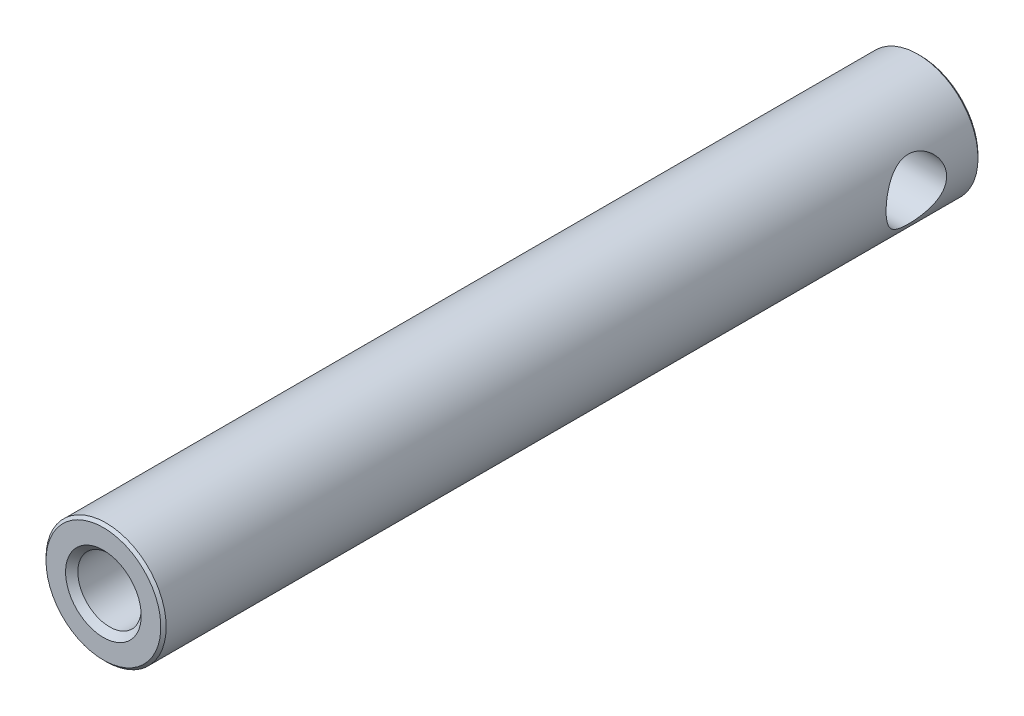
ISO-10303-21;
HEADER;
FILE_DESCRIPTION(('STEP AP214'),'2;1');
FILE_NAME('part.step','',(''),(''),'','','');
FILE_SCHEMA(('AUTOMOTIVE_DESIGN { 1 0 10303 214 1 1 1 1 }'));
ENDSEC;
DATA;
#1=APPLICATION_CONTEXT('core data for automotive mechanical design processes');
#2=APPLICATION_PROTOCOL_DEFINITION('international standard','automotive_design',2000,#1);
#3=PRODUCT_CONTEXT('',#1,'mechanical');
#4=PRODUCT('Part','Part','',(#3));
#5=PRODUCT_RELATED_PRODUCT_CATEGORY('part','',(#4));
#6=PRODUCT_DEFINITION_FORMATION('','',#4);
#7=PRODUCT_DEFINITION_CONTEXT('part definition',#1,'design');
#8=PRODUCT_DEFINITION('design','',#6,#7);
#9=PRODUCT_DEFINITION_SHAPE('','',#8);
#10=(LENGTH_UNIT() NAMED_UNIT(*) SI_UNIT(.MILLI.,.METRE.));
#11=(NAMED_UNIT(*) PLANE_ANGLE_UNIT() SI_UNIT($,.RADIAN.));
#12=(NAMED_UNIT(*) SI_UNIT($,.STERADIAN.) SOLID_ANGLE_UNIT());
#13=UNCERTAINTY_MEASURE_WITH_UNIT(LENGTH_MEASURE(1.E-05),#10,'distance_accuracy_value','');
#14=(GEOMETRIC_REPRESENTATION_CONTEXT(3) GLOBAL_UNCERTAINTY_ASSIGNED_CONTEXT((#13)) GLOBAL_UNIT_ASSIGNED_CONTEXT((#10,
#11,#12)) REPRESENTATION_CONTEXT('',''));
#15=CARTESIAN_POINT('',(0.,0.,0.));
#16=DIRECTION('',(0.,0.,1.));
#17=DIRECTION('',(1.,0.,0.));
#18=AXIS2_PLACEMENT_3D('',#15,#16,#17);
#19=CARTESIAN_POINT('',(0.,0.,62.5858800000856));
#20=DIRECTION('',(0.,0.,1.));
#21=DIRECTION('',(1.,0.,0.));
#22=AXIS2_PLACEMENT_3D('',#19,#20,#21);
#23=CONICAL_SURFACE('',#22,4.18800000011288,1.09918075892234);
#24=CARTESIAN_POINT('',(0.,0.,62.58588));
#25=DIRECTION('',(0.,0.,1.));
#26=DIRECTION('',(0.,-1.,0.));
#27=AXIS2_PLACEMENT_3D('',#24,#25,#26);
#28=CIRCLE('',#27,4.188);
#29=CARTESIAN_POINT('',(0.,-4.188,62.58588));
#30=VERTEX_POINT('',#29);
#31=EDGE_CURVE('E83',#30,#30,#28,.T.);
#32=ORIENTED_EDGE('',*,*,#31,.T.);
#33=EDGE_LOOP('',(#32));
#34=FACE_BOUND('',#33,.T.);
#35=CARTESIAN_POINT('',(0.,5.6843418860808E-11,60.4500000000314));
#36=VERTEX_POINT('',#35);
#37=VERTEX_LOOP('',#36);
#38=FACE_BOUND('',#37,.T.);
#39=ADVANCED_FACE('F17',(#34,#38),#23,.F.);
#40=CARTESIAN_POINT('',(0.,0.,60.45));
#41=DIRECTION('',(0.,0.,1.));
#42=DIRECTION('',(0.,-1.,0.));
#43=AXIS2_PLACEMENT_3D('',#40,#41,#42);
#44=CYLINDRICAL_SURFACE('',#43,4.188);
#45=ORIENTED_EDGE('',*,*,#31,.F.);
#46=EDGE_LOOP('',(#45));
#47=FACE_BOUND('',#46,.T.);
#48=CARTESIAN_POINT('',(0.,0.,98.6880000000383));
#49=DIRECTION('',(0.,0.,1.));
#50=DIRECTION('',(0.,-1.,0.));
#51=AXIS2_PLACEMENT_3D('',#48,#49,#50);
#52=CIRCLE('',#51,4.18799999994236);
#53=CARTESIAN_POINT('',(0.,-4.18799999994235,98.6880000000383));
#54=VERTEX_POINT('',#53);
#55=EDGE_CURVE('E78',#54,#54,#52,.T.);
#56=ORIENTED_EDGE('',*,*,#55,.T.);
#57=EDGE_LOOP('',(#56));
#58=FACE_BOUND('',#57,.T.);
#59=ADVANCED_FACE('F30',(#47,#58),#44,.F.);
#60=CARTESIAN_POINT('',(0.,0.,99.4999999999777));
#61=DIRECTION('',(0.,0.,1.));
#62=DIRECTION('',(1.,0.,0.));
#63=AXIS2_PLACEMENT_3D('',#60,#61,#62);
#64=CONICAL_SURFACE('',#63,4.99999999988177,0.785398163397448);
#65=CARTESIAN_POINT('',(0.,0.,99.5000000000346));
#66=DIRECTION('',(0.,0.,1.));
#67=DIRECTION('',(1.,0.,0.));
#68=AXIS2_PLACEMENT_3D('',#65,#66,#67);
#69=CIRCLE('',#68,4.99999999993862);
#70=CARTESIAN_POINT('',(4.99999999993862,0.,99.5000000000346));
#71=VERTEX_POINT('',#70);
#72=EDGE_CURVE('E20',#71,#71,#69,.T.);
#73=ORIENTED_EDGE('',*,*,#72,.T.);
#74=EDGE_LOOP('',(#73));
#75=FACE_BOUND('',#74,.T.);
#76=ORIENTED_EDGE('',*,*,#55,.F.);
#77=EDGE_LOOP('',(#76));
#78=FACE_BOUND('',#77,.T.);
#79=ADVANCED_FACE('F35',(#75,#78),#64,.F.);
#80=CARTESIAN_POINT('',(0.,0.,99.5));
#81=DIRECTION('',(0.,0.,-1.));
#82=DIRECTION('',(-1.,0.,0.));
#83=AXIS2_PLACEMENT_3D('',#80,#81,#82);
#84=PLANE('',#83);
#85=ORIENTED_EDGE('',*,*,#72,.F.);
#86=EDGE_LOOP('',(#85));
#87=FACE_BOUND('',#86,.T.);
#88=CARTESIAN_POINT('',(0.,0.,99.5000000000346));
#89=DIRECTION('',(0.,0.,-1.));
#90=DIRECTION('',(-1.,0.,0.));
#91=AXIS2_PLACEMENT_3D('',#88,#89,#90);
#92=CIRCLE('',#91,7.58644660936625);
#93=CARTESIAN_POINT('',(-7.58644660936625,0.,99.5000000000346));
#94=VERTEX_POINT('',#93);
#95=EDGE_CURVE('E69',#94,#94,#92,.T.);
#96=ORIENTED_EDGE('',*,*,#95,.F.);
#97=EDGE_LOOP('',(#96));
#98=FACE_BOUND('',#97,.T.);
#99=ADVANCED_FACE('F104',(#87,#98),#84,.F.);
#100=CARTESIAN_POINT('',(0.,7.58644660940673,-8.50000000000001));
#101=DIRECTION('',(0.,0.,1.));
#102=DIRECTION('',(1.,0.,0.));
#103=AXIS2_PLACEMENT_3D('',#100,#101,#102);
#104=PLANE('',#103);
#105=CARTESIAN_POINT('',(0.,0.,-8.50000000002638));
#106=DIRECTION('',(0.,0.,1.));
#107=DIRECTION('',(1.,0.,0.));
#108=AXIS2_PLACEMENT_3D('',#105,#106,#107);
#109=CIRCLE('',#108,7.58644660936625);
#110=CARTESIAN_POINT('',(7.58644660936625,0.,-8.50000000002638));
#111=VERTEX_POINT('',#110);
#112=EDGE_CURVE('E66',#111,#111,#109,.T.);
#113=ORIENTED_EDGE('',*,*,#112,.F.);
#114=EDGE_LOOP('',(#113));
#115=FACE_BOUND('',#114,.T.);
#116=ADVANCED_FACE('F98',(#115),#104,.F.);
#117=CARTESIAN_POINT('',(0.,0.,99.1464466093248));
#118=DIRECTION('',(0.,0.,-1.));
#119=DIRECTION('',(-1.,0.,0.));
#120=AXIS2_PLACEMENT_3D('',#117,#118,#119);
#121=CONICAL_SURFACE('',#120,7.94000000013284,0.785398163477837);
#122=ORIENTED_EDGE('',*,*,#95,.T.);
#123=EDGE_LOOP('',(#122));
#124=FACE_BOUND('',#123,.T.);
#125=CARTESIAN_POINT('',(0.,0.,99.1464466094067));
#126=DIRECTION('',(0.,0.,1.));
#127=DIRECTION('',(1.,0.,0.));
#128=AXIS2_PLACEMENT_3D('',#125,#126,#127);
#129=CIRCLE('',#128,7.94);
#130=CARTESIAN_POINT('',(7.94,0.,99.1464466094067));
#131=VERTEX_POINT('',#130);
#132=EDGE_CURVE('E65',#131,#131,#129,.F.);
#133=ORIENTED_EDGE('',*,*,#132,.F.);
#134=EDGE_LOOP('',(#133));
#135=FACE_BOUND('',#134,.T.);
#136=ADVANCED_FACE('F96',(#124,#135),#121,.T.);
#137=CARTESIAN_POINT('',(0.,0.,-8.14644660948716));
#138=DIRECTION('',(0.,0.,1.));
#139=DIRECTION('',(1.,0.,0.));
#140=AXIS2_PLACEMENT_3D('',#137,#138,#139);
#141=CONICAL_SURFACE('',#140,7.93999999990547,0.785398163397448);
#142=CARTESIAN_POINT('',(0.,0.,-8.14644660940674));
#143=DIRECTION('',(0.,0.,1.));
#144=DIRECTION('',(1.,0.,0.));
#145=AXIS2_PLACEMENT_3D('',#142,#143,#144);
#146=CIRCLE('',#145,7.94);
#147=CARTESIAN_POINT('',(7.94,0.,-8.14644660940674));
#148=VERTEX_POINT('',#147);
#149=EDGE_CURVE('E25',#148,#148,#146,.T.);
#150=ORIENTED_EDGE('',*,*,#149,.F.);
#151=EDGE_LOOP('',(#150));
#152=FACE_BOUND('',#151,.T.);
#153=ORIENTED_EDGE('',*,*,#112,.T.);
#154=EDGE_LOOP('',(#153));
#155=FACE_BOUND('',#154,.T.);
#156=ADVANCED_FACE('F45',(#152,#155),#141,.T.);
#157=CARTESIAN_POINT('',(7.99999999999999,0.,0.));
#158=DIRECTION('',(-1.,0.,0.));
#159=DIRECTION('',(0.,0.,1.));
#160=AXIS2_PLACEMENT_3D('',#157,#158,#159);
#161=CYLINDRICAL_SURFACE('',#160,4.);
#162=CARTESIAN_POINT('',(7.94,0.,4.));
#163=CARTESIAN_POINT('',(7.9400021109714,0.10517109395759,4.00000239787744));
#164=CARTESIAN_POINT('',(7.93790678019679,0.210316836597848,3.99584935438447));
#165=CARTESIAN_POINT('',(7.92958587567543,0.419823475354952,3.97929473117448));
#166=CARTESIAN_POINT('',(7.9233594753153,0.524184210166777,3.96689150062098));
#167=CARTESIAN_POINT('',(7.90692758591714,0.73136809049458,3.93396847953211));
#168=CARTESIAN_POINT('',(7.8967195406061,0.834190204069325,3.91344347457849));
#169=CARTESIAN_POINT('',(7.87259012597145,1.03751294018156,3.86452074199203));
#170=CARTESIAN_POINT('',(7.85866727708254,1.13801262035099,3.83611987731341));
#171=CARTESIAN_POINT('',(7.8119366165829,1.43420400295598,3.7397802716423));
#172=CARTESIAN_POINT('',(7.77408447370945,1.62556440007457,3.66054625467148));
#173=CARTESIAN_POINT('',(7.68839341943362,1.99191779590018,3.47484599731364));
#174=CARTESIAN_POINT('',(7.64055328871838,2.16690879248435,3.36837643170946));
#175=CARTESIAN_POINT('',(7.5358349439488,2.50767653621529,3.12380363165635));
#176=CARTESIAN_POINT('',(7.47858322455208,2.67223820509634,2.98416577819797));
#177=CARTESIAN_POINT('',(7.36270510461318,2.97670513270393,2.68058834780447));
#178=CARTESIAN_POINT('',(7.30407772577618,3.11659220258305,2.516631006328));
#179=CARTESIAN_POINT('',(7.18670638897149,3.37892137501901,2.15333411015012));
#180=CARTESIAN_POINT('',(7.12831956831329,3.49911032903864,1.95222214894955));
#181=CARTESIAN_POINT('',(7.05035928556317,3.65230423274154,1.63538564166146));
#182=CARTESIAN_POINT('',(7.02596923600123,3.69886509509496,1.52720626159389));
#183=CARTESIAN_POINT('',(6.98131184278196,3.78247681559869,1.30643507869609));
#184=CARTESIAN_POINT('',(6.96104204321276,3.81953334236221,1.19384595235427));
#185=CARTESIAN_POINT('',(6.92653922743123,3.88173219898337,0.971923797884869));
#186=CARTESIAN_POINT('',(6.91201808020868,3.90745368893792,0.862797597732118));
#187=CARTESIAN_POINT('',(6.88797006236582,3.94969129329074,0.642284704688069));
#188=CARTESIAN_POINT('',(6.87844052265092,3.96621232762306,0.530899253021939));
#189=CARTESIAN_POINT('',(6.86478534470937,3.98980066613343,0.306869956275632));
#190=CARTESIAN_POINT('',(6.86065634843621,3.99687384502621,0.19422693714066));
#191=CARTESIAN_POINT('',(6.8579784520976,4.00146718414805,-0.0313135204275492));
#192=CARTESIAN_POINT('',(6.85942900510613,3.99898828070403,-0.14421093284011));
#193=CARTESIAN_POINT('',(6.86732764098408,3.9854061164131,-0.355424782495027));
#194=CARTESIAN_POINT('',(6.87314324231267,3.97539398040162,-0.453836838006297));
#195=CARTESIAN_POINT('',(6.8888119576894,3.94817775660937,-0.649345348883929));
#196=CARTESIAN_POINT('',(6.89866633705346,3.93097141490908,-0.746441382094042));
#197=CARTESIAN_POINT('',(6.93383493401204,3.86883248388509,-1.03474670229585));
#198=CARTESIAN_POINT('',(6.96476070576025,3.81337040013363,-1.22311705759464));
#199=CARTESIAN_POINT('',(7.03876653216191,3.67499556903839,-1.59191402283414));
#200=CARTESIAN_POINT('',(7.08211266158379,3.59147409868339,-1.77205379512791));
#201=CARTESIAN_POINT('',(7.17609521767701,3.39979960920808,-2.11665960969997));
#202=CARTESIAN_POINT('',(7.2267347677049,3.2916360256693,-2.28111888650988));
#203=CARTESIAN_POINT('',(7.33747758731572,3.03753432778876,-2.61196269860414));
#204=CARTESIAN_POINT('',(7.39795938469302,2.88852435030697,-2.77586333755504));
#205=CARTESIAN_POINT('',(7.51633232630161,2.56475930779021,-3.07748589754143));
#206=CARTESIAN_POINT('',(7.57422169861303,2.38998697408625,-3.21519011602322));
#207=CARTESIAN_POINT('',(7.65606236060352,2.10681109889912,-3.40220720368849));
#208=CARTESIAN_POINT('',(7.6830684837775,2.00633652326116,-3.46242744968945));
#209=CARTESIAN_POINT('',(7.73403026805902,1.79990389166799,-3.5740868804643));
#210=CARTESIAN_POINT('',(7.75798727934426,1.69394829220407,-3.62552995531958));
#211=CARTESIAN_POINT('',(7.80212218961932,1.47739106764968,-3.71903311464408));
#212=CARTESIAN_POINT('',(7.82230522066665,1.36679600600195,-3.76110595635713));
#213=CARTESIAN_POINT('',(7.85831264098591,1.1417142044151,-3.83543118397181));
#214=CARTESIAN_POINT('',(7.87413869813912,1.0272289725688,-3.86768732827663));
#215=CARTESIAN_POINT('',(7.9046977160168,0.76268201701538,-3.92957687726781));
#216=CARTESIAN_POINT('',(7.91787625711603,0.611656311751802,-3.95593126334916));
#217=CARTESIAN_POINT('',(7.93552539716494,0.307068887664587,-3.99114014757892));
#218=CARTESIAN_POINT('',(7.93999691883196,0.153507439303256,-3.99999650006469));
#219=CARTESIAN_POINT('',(7.9400021109714,-0.10517109395759,-4.00000239787744));
#220=CARTESIAN_POINT('',(7.93790678019679,-0.210316836597848,-3.99584935438447));
#221=CARTESIAN_POINT('',(7.92958587567543,-0.419823475354952,-3.97929473117448));
#222=CARTESIAN_POINT('',(7.9233594753153,-0.524184210166778,-3.96689150062098));
#223=CARTESIAN_POINT('',(7.90692758591714,-0.731368090494581,-3.93396847953211));
#224=CARTESIAN_POINT('',(7.8967195406061,-0.834190204069326,-3.91344347457849));
#225=CARTESIAN_POINT('',(7.87259012597145,-1.03751294018156,-3.86452074199203));
#226=CARTESIAN_POINT('',(7.85866727708254,-1.13801262035099,-3.83611987731341));
#227=CARTESIAN_POINT('',(7.8119366165829,-1.43420400295598,-3.7397802716423));
#228=CARTESIAN_POINT('',(7.77408447370945,-1.62556440007457,-3.66054625467148));
#229=CARTESIAN_POINT('',(7.68839341943362,-1.99191779590018,-3.47484599731364));
#230=CARTESIAN_POINT('',(7.64055328871838,-2.16690879248435,-3.36837643170946));
#231=CARTESIAN_POINT('',(7.5358349439488,-2.50767653621529,-3.12380363165635));
#232=CARTESIAN_POINT('',(7.47858322455208,-2.67223820509634,-2.98416577819797));
#233=CARTESIAN_POINT('',(7.36270510461317,-2.97670513270393,-2.68058834780447));
#234=CARTESIAN_POINT('',(7.30407772577618,-3.11659220258305,-2.516631006328));
#235=CARTESIAN_POINT('',(7.18670638897149,-3.37892137501901,-2.15333411015012));
#236=CARTESIAN_POINT('',(7.12831956831329,-3.49911032903864,-1.95222214894955));
#237=CARTESIAN_POINT('',(7.05035928556317,-3.65230423274154,-1.63538564166146));
#238=CARTESIAN_POINT('',(7.02596923600123,-3.69886509509496,-1.52720626159389));
#239=CARTESIAN_POINT('',(6.98131184278196,-3.78247681559869,-1.30643507869608));
#240=CARTESIAN_POINT('',(6.96104204321276,-3.81953334236221,-1.19384595235427));
#241=CARTESIAN_POINT('',(6.92653922743123,-3.88173219898337,-0.971923797884867));
#242=CARTESIAN_POINT('',(6.91201808020868,-3.90745368893792,-0.862797597732116));
#243=CARTESIAN_POINT('',(6.88797006236582,-3.94969129329074,-0.642284704688067));
#244=CARTESIAN_POINT('',(6.87844052265092,-3.96621232762306,-0.530899253021937));
#245=CARTESIAN_POINT('',(6.86478534470937,-3.98980066613343,-0.306869956275631));
#246=CARTESIAN_POINT('',(6.86065634843621,-3.99687384502621,-0.19422693714066));
#247=CARTESIAN_POINT('',(6.85797845209761,-4.00146718414805,0.0313135204275494));
#248=CARTESIAN_POINT('',(6.85942900510613,-3.99898828070403,0.144210932840111));
#249=CARTESIAN_POINT('',(6.86732764098408,-3.9854061164131,0.355424782495026));
#250=CARTESIAN_POINT('',(6.87314324231267,-3.97539398040162,0.453836838006296));
#251=CARTESIAN_POINT('',(6.8888119576894,-3.94817775660937,0.649345348883927));
#252=CARTESIAN_POINT('',(6.89866633705346,-3.93097141490908,0.74644138209404));
#253=CARTESIAN_POINT('',(6.93383493401204,-3.86883248388509,1.03474670229584));
#254=CARTESIAN_POINT('',(6.96476070576025,-3.81337040013363,1.22311705759464));
#255=CARTESIAN_POINT('',(7.03876653216191,-3.67499556903839,1.59191402283413));
#256=CARTESIAN_POINT('',(7.08211266158379,-3.59147409868339,1.7720537951279));
#257=CARTESIAN_POINT('',(7.17609521767701,-3.39979960920808,2.11665960969997));
#258=CARTESIAN_POINT('',(7.2267347677049,-3.2916360256693,2.28111888650988));
#259=CARTESIAN_POINT('',(7.33747758731572,-3.03753432778876,2.61196269860414));
#260=CARTESIAN_POINT('',(7.39795938469302,-2.88852435030697,2.77586333755504));
#261=CARTESIAN_POINT('',(7.51633232630161,-2.5647593077902,3.07748589754143));
#262=CARTESIAN_POINT('',(7.57422169861302,-2.38998697408625,3.21519011602322));
#263=CARTESIAN_POINT('',(7.65606236060352,-2.10681109889912,3.40220720368849));
#264=CARTESIAN_POINT('',(7.6830684837775,-2.00633652326116,3.46242744968945));
#265=CARTESIAN_POINT('',(7.73403026805902,-1.799903891668,3.5740868804643));
#266=CARTESIAN_POINT('',(7.75798727934426,-1.69394829220408,3.62552995531958));
#267=CARTESIAN_POINT('',(7.80212218961932,-1.47739106764968,3.71903311464408));
#268=CARTESIAN_POINT('',(7.82230522066665,-1.36679600600195,3.76110595635713));
#269=CARTESIAN_POINT('',(7.85831264098591,-1.1417142044151,3.83543118397181));
#270=CARTESIAN_POINT('',(7.87413869813912,-1.0272289725688,3.86768732827663));
#271=CARTESIAN_POINT('',(7.9046977160168,-0.762682017015381,3.9295768772678));
#272=CARTESIAN_POINT('',(7.91787625711603,-0.611656311751804,3.95593126334916));
#273=CARTESIAN_POINT('',(7.93552539716494,-0.307068887664589,3.99114014757892));
#274=CARTESIAN_POINT('',(7.93999691883196,-0.153507439303257,3.99999650006469));
#275=CARTESIAN_POINT('',(7.94,0.,4.));
#276=B_SPLINE_CURVE_WITH_KNOTS('',3,(#162,#163,#164,#165,#166,#167,#168,#169,#170,#171,#172,
#173,#174,#175,#176,#177,#178,#179,#180,#181,#182,#183,#184,#185,#186,#187,#188,#189,#190,#191,
#192,#193,#194,#195,#196,#197,#198,#199,#200,#201,#202,#203,#204,#205,#206,#207,#208,#209,#210,
#211,#212,#213,#214,#215,#216,#217,#218,#219,#220,#221,#222,#223,#224,#225,#226,#227,#228,#229,
#230,#231,#232,#233,#234,#235,#236,#237,#238,#239,#240,#241,#242,#243,#244,#245,#246,#247,#248,
#249,#250,#251,#252,#253,#254,#255,#256,#257,#258,#259,#260,#261,#262,#263,#264,#265,#266,#267,
#268,#269,#270,#271,#272,#273,#274,#275),.UNSPECIFIED.,.T.,.F.,(4,2,2,2,2,2,2,2,2,2,2,2,2,2,2,2,
2,2,2,2,2,2,2,2,2,2,2,2,2,2,2,2,2,2,2,2,2,2,2,2,2,2,2,2,2,2,2,2,2,2,2,2,2,2,2,2,4),(0.,
0.315366666890194,0.630796456648916,0.946429091058883,1.26218762661281,1.89076499429388,
2.5194191423142,3.18645959364785,3.8539897165361,4.57428781232892,4.9346804755429,
5.29485768946995,5.63353447145292,5.97202997204608,6.31031489663471,6.64856666225202,
6.94547631909969,7.24247906649012,7.83605706901757,8.44344711597815,9.05109805119683,
9.73706823611777,10.4235003398864,10.7837316876955,11.1438029622828,11.5033809742681,
11.8628211451693,12.3231782527755,12.7834865718602,13.0988532387504,13.4142830285091,
13.7299156629191,14.045674198473,14.6742515661541,15.3029057141744,15.9699461655081,
16.6374762883963,17.3577743841891,17.7181670474031,18.0783442613302,18.4170210433131,
18.7555165439063,19.0938014684949,19.4320532341123,19.7289628909599,20.0259656383503,
20.6195436408778,21.2269336878384,21.8345846230571,22.520554807978,23.2069869117466,
23.5672182595557,23.927289534143,24.2868675461283,24.6463077170295,25.1066648246358,
25.5669731437205),.UNSPECIFIED.);
#277=CARTESIAN_POINT('',(7.94,0.,4.));
#278=VERTEX_POINT('',#277);
#279=EDGE_CURVE('E59',#278,#278,#276,.T.);
#280=ORIENTED_EDGE('',*,*,#279,.F.);
#281=EDGE_LOOP('',(#280));
#282=FACE_BOUND('',#281,.T.);
#283=CARTESIAN_POINT('',(-7.94,0.,-4.));
#284=CARTESIAN_POINT('',(-7.9400021109714,0.105171093957591,-4.00000239787744));
#285=CARTESIAN_POINT('',(-7.93790678019679,0.210316836597849,-3.99584935438447));
#286=CARTESIAN_POINT('',(-7.92958587567543,0.419823475354953,-3.97929473117448));
#287=CARTESIAN_POINT('',(-7.9233594753153,0.524184210166779,-3.96689150062098));
#288=CARTESIAN_POINT('',(-7.90692758591714,0.731368090494581,-3.93396847953211));
#289=CARTESIAN_POINT('',(-7.8967195406061,0.834190204069326,-3.91344347457849));
#290=CARTESIAN_POINT('',(-7.87259012597145,1.03751294018156,-3.86452074199203));
#291=CARTESIAN_POINT('',(-7.85866727708254,1.13801262035099,-3.83611987731341));
#292=CARTESIAN_POINT('',(-7.8119366165829,1.43420400295598,-3.7397802716423));
#293=CARTESIAN_POINT('',(-7.77408447370945,1.62556440007457,-3.66054625467148));
#294=CARTESIAN_POINT('',(-7.68839341943362,1.99191779590018,-3.47484599731364));
#295=CARTESIAN_POINT('',(-7.64055328871838,2.16690879248435,-3.36837643170946));
#296=CARTESIAN_POINT('',(-7.5358349439488,2.50767653621529,-3.12380363165635));
#297=CARTESIAN_POINT('',(-7.47858322455208,2.67223820509634,-2.98416577819797));
#298=CARTESIAN_POINT('',(-7.36270510461317,2.97670513270393,-2.68058834780447));
#299=CARTESIAN_POINT('',(-7.30407772577618,3.11659220258305,-2.516631006328));
#300=CARTESIAN_POINT('',(-7.18670638897149,3.37892137501901,-2.15333411015011));
#301=CARTESIAN_POINT('',(-7.12831956831329,3.49911032903864,-1.95222214894955));
#302=CARTESIAN_POINT('',(-7.05035928556317,3.65230423274154,-1.63538564166146));
#303=CARTESIAN_POINT('',(-7.02596923600123,3.69886509509496,-1.52720626159389));
#304=CARTESIAN_POINT('',(-6.98131184278196,3.78247681559869,-1.30643507869609));
#305=CARTESIAN_POINT('',(-6.96104204321276,3.81953334236221,-1.19384595235427));
#306=CARTESIAN_POINT('',(-6.92653922743123,3.88173219898337,-0.971923797884868));
#307=CARTESIAN_POINT('',(-6.91201808020868,3.90745368893792,-0.862797597732118));
#308=CARTESIAN_POINT('',(-6.88797006236582,3.94969129329074,-0.642284704688068));
#309=CARTESIAN_POINT('',(-6.87844052265092,3.96621232762306,-0.530899253021938));
#310=CARTESIAN_POINT('',(-6.86478534470937,3.98980066613343,-0.306869956275631));
#311=CARTESIAN_POINT('',(-6.86065634843621,3.99687384502621,-0.194226937140658));
#312=CARTESIAN_POINT('',(-6.8579784520976,4.00146718414805,0.0313135204275505));
#313=CARTESIAN_POINT('',(-6.85942900510613,3.99898828070403,0.144210932840111));
#314=CARTESIAN_POINT('',(-6.86732764098408,3.9854061164131,0.355424782495027));
#315=CARTESIAN_POINT('',(-6.87314324231267,3.97539398040162,0.453836838006298));
#316=CARTESIAN_POINT('',(-6.8888119576894,3.94817775660937,0.649345348883929));
#317=CARTESIAN_POINT('',(-6.89866633705346,3.93097141490908,0.746441382094042));
#318=CARTESIAN_POINT('',(-6.93383493401204,3.86883248388509,1.03474670229585));
#319=CARTESIAN_POINT('',(-6.96476070576025,3.81337040013363,1.22311705759464));
#320=CARTESIAN_POINT('',(-7.03876653216191,3.67499556903839,1.59191402283414));
#321=CARTESIAN_POINT('',(-7.08211266158379,3.59147409868339,1.77205379512791));
#322=CARTESIAN_POINT('',(-7.17609521767701,3.39979960920808,2.11665960969997));
#323=CARTESIAN_POINT('',(-7.2267347677049,3.2916360256693,2.28111888650988));
#324=CARTESIAN_POINT('',(-7.33747758731572,3.03753432778876,2.61196269860414));
#325=CARTESIAN_POINT('',(-7.39795938469302,2.88852435030697,2.77586333755504));
#326=CARTESIAN_POINT('',(-7.51633232630161,2.5647593077902,3.07748589754143));
#327=CARTESIAN_POINT('',(-7.57422169861303,2.38998697408625,3.21519011602322));
#328=CARTESIAN_POINT('',(-7.65606236060352,2.10681109889911,3.40220720368849));
#329=CARTESIAN_POINT('',(-7.6830684837775,2.00633652326116,3.46242744968945));
#330=CARTESIAN_POINT('',(-7.73403026805902,1.79990389166799,3.5740868804643));
#331=CARTESIAN_POINT('',(-7.75798727934426,1.69394829220407,3.62552995531959));
#332=CARTESIAN_POINT('',(-7.80212218961932,1.47739106764968,3.71903311464408));
#333=CARTESIAN_POINT('',(-7.82230522066665,1.36679600600195,3.76110595635713));
#334=CARTESIAN_POINT('',(-7.85831264098591,1.1417142044151,3.83543118397181));
#335=CARTESIAN_POINT('',(-7.87413869813913,1.0272289725688,3.86768732827663));
#336=CARTESIAN_POINT('',(-7.90469771601681,0.76268201701538,3.92957687726781));
#337=CARTESIAN_POINT('',(-7.91787625711603,0.611656311751802,3.95593126334916));
#338=CARTESIAN_POINT('',(-7.93552539716494,0.307068887664587,3.99114014757892));
#339=CARTESIAN_POINT('',(-7.93999691883196,0.153507439303256,3.99999650006469));
#340=CARTESIAN_POINT('',(-7.9400021109714,-0.10517109395759,4.00000239787744));
#341=CARTESIAN_POINT('',(-7.93790678019679,-0.210316836597848,3.99584935438447));
#342=CARTESIAN_POINT('',(-7.92958587567543,-0.419823475354952,3.97929473117448));
#343=CARTESIAN_POINT('',(-7.9233594753153,-0.524184210166778,3.96689150062098));
#344=CARTESIAN_POINT('',(-7.90692758591714,-0.731368090494581,3.93396847953211));
#345=CARTESIAN_POINT('',(-7.8967195406061,-0.834190204069326,3.91344347457849));
#346=CARTESIAN_POINT('',(-7.87259012597145,-1.03751294018156,3.86452074199203));
#347=CARTESIAN_POINT('',(-7.85866727708254,-1.13801262035099,3.83611987731341));
#348=CARTESIAN_POINT('',(-7.8119366165829,-1.43420400295598,3.7397802716423));
#349=CARTESIAN_POINT('',(-7.77408447370945,-1.62556440007457,3.66054625467148));
#350=CARTESIAN_POINT('',(-7.68839341943362,-1.99191779590018,3.47484599731364));
#351=CARTESIAN_POINT('',(-7.64055328871838,-2.16690879248435,3.36837643170946));
#352=CARTESIAN_POINT('',(-7.5358349439488,-2.50767653621529,3.12380363165635));
#353=CARTESIAN_POINT('',(-7.47858322455208,-2.67223820509634,2.98416577819797));
#354=CARTESIAN_POINT('',(-7.36270510461317,-2.97670513270393,2.68058834780447));
#355=CARTESIAN_POINT('',(-7.30407772577618,-3.11659220258305,2.516631006328));
#356=CARTESIAN_POINT('',(-7.18670638897149,-3.37892137501901,2.15333411015011));
#357=CARTESIAN_POINT('',(-7.12831956831329,-3.49911032903864,1.95222214894955));
#358=CARTESIAN_POINT('',(-7.05035928556317,-3.65230423274154,1.63538564166146));
#359=CARTESIAN_POINT('',(-7.02596923600123,-3.69886509509496,1.52720626159389));
#360=CARTESIAN_POINT('',(-6.98131184278196,-3.78247681559869,1.30643507869608));
#361=CARTESIAN_POINT('',(-6.96104204321276,-3.81953334236221,1.19384595235427));
#362=CARTESIAN_POINT('',(-6.92653922743123,-3.88173219898337,0.971923797884867));
#363=CARTESIAN_POINT('',(-6.91201808020868,-3.90745368893792,0.862797597732117));
#364=CARTESIAN_POINT('',(-6.88797006236582,-3.94969129329074,0.642284704688068));
#365=CARTESIAN_POINT('',(-6.87844052265092,-3.96621232762306,0.530899253021938));
#366=CARTESIAN_POINT('',(-6.86478534470937,-3.98980066613343,0.306869956275633));
#367=CARTESIAN_POINT('',(-6.86065634843621,-3.99687384502621,0.194226937140661));
#368=CARTESIAN_POINT('',(-6.8579784520976,-4.00146718414805,-0.031313520427549));
#369=CARTESIAN_POINT('',(-6.85942900510613,-3.99898828070403,-0.14421093284011));
#370=CARTESIAN_POINT('',(-6.86732764098408,-3.9854061164131,-0.355424782495028));
#371=CARTESIAN_POINT('',(-6.87314324231267,-3.97539398040162,-0.453836838006298));
#372=CARTESIAN_POINT('',(-6.8888119576894,-3.94817775660937,-0.649345348883929));
#373=CARTESIAN_POINT('',(-6.89866633705346,-3.93097141490908,-0.746441382094042));
#374=CARTESIAN_POINT('',(-6.93383493401204,-3.86883248388509,-1.03474670229585));
#375=CARTESIAN_POINT('',(-6.96476070576025,-3.81337040013363,-1.22311705759464));
#376=CARTESIAN_POINT('',(-7.03876653216191,-3.67499556903839,-1.59191402283414));
#377=CARTESIAN_POINT('',(-7.08211266158379,-3.59147409868339,-1.77205379512791));
#378=CARTESIAN_POINT('',(-7.17609521767701,-3.39979960920808,-2.11665960969997));
#379=CARTESIAN_POINT('',(-7.2267347677049,-3.2916360256693,-2.28111888650988));
#380=CARTESIAN_POINT('',(-7.33747758731572,-3.03753432778876,-2.61196269860415));
#381=CARTESIAN_POINT('',(-7.39795938469302,-2.88852435030697,-2.77586333755504));
#382=CARTESIAN_POINT('',(-7.51633232630161,-2.5647593077902,-3.07748589754143));
#383=CARTESIAN_POINT('',(-7.57422169861303,-2.38998697408625,-3.21519011602322));
#384=CARTESIAN_POINT('',(-7.65606236060352,-2.10681109889911,-3.40220720368849));
#385=CARTESIAN_POINT('',(-7.6830684837775,-2.00633652326116,-3.46242744968945));
#386=CARTESIAN_POINT('',(-7.73403026805902,-1.79990389166799,-3.5740868804643));
#387=CARTESIAN_POINT('',(-7.75798727934427,-1.69394829220407,-3.62552995531959));
#388=CARTESIAN_POINT('',(-7.80212218961932,-1.47739106764968,-3.71903311464408));
#389=CARTESIAN_POINT('',(-7.82230522066665,-1.36679600600195,-3.76110595635713));
#390=CARTESIAN_POINT('',(-7.85831264098591,-1.1417142044151,-3.83543118397181));
#391=CARTESIAN_POINT('',(-7.87413869813912,-1.0272289725688,-3.86768732827663));
#392=CARTESIAN_POINT('',(-7.9046977160168,-0.762682017015379,-3.92957687726781));
#393=CARTESIAN_POINT('',(-7.91787625711603,-0.611656311751801,-3.95593126334916));
#394=CARTESIAN_POINT('',(-7.93552539716494,-0.307068887664585,-3.99114014757892));
#395=CARTESIAN_POINT('',(-7.93999691883196,-0.153507439303255,-3.99999650006469));
#396=CARTESIAN_POINT('',(-7.94,0.,-4.));
#397=B_SPLINE_CURVE_WITH_KNOTS('',3,(#283,#284,#285,#286,#287,#288,#289,#290,#291,#292,#293,
#294,#295,#296,#297,#298,#299,#300,#301,#302,#303,#304,#305,#306,#307,#308,#309,#310,#311,#312,
#313,#314,#315,#316,#317,#318,#319,#320,#321,#322,#323,#324,#325,#326,#327,#328,#329,#330,#331,
#332,#333,#334,#335,#336,#337,#338,#339,#340,#341,#342,#343,#344,#345,#346,#347,#348,#349,#350,
#351,#352,#353,#354,#355,#356,#357,#358,#359,#360,#361,#362,#363,#364,#365,#366,#367,#368,#369,
#370,#371,#372,#373,#374,#375,#376,#377,#378,#379,#380,#381,#382,#383,#384,#385,#386,#387,#388,
#389,#390,#391,#392,#393,#394,#395,#396),.UNSPECIFIED.,.T.,.F.,(4,2,2,2,2,2,2,2,2,2,2,2,2,2,2,2,
2,2,2,2,2,2,2,2,2,2,2,2,2,2,2,2,2,2,2,2,2,2,2,2,2,2,2,2,2,2,2,2,2,2,2,2,2,2,2,2,4),(0.,
0.315366666890194,0.630796456648916,0.946429091058884,1.26218762661281,1.89076499429388,
2.5194191423142,3.18645959364785,3.8539897165361,4.57428781232892,4.9346804755429,
5.29485768946995,5.63353447145292,5.97202997204608,6.31031489663471,6.64856666225202,
6.94547631909968,7.24247906649012,7.83605706901756,8.44344711597815,9.05109805119683,
9.73706823611777,10.4235003398864,10.7837316876955,11.1438029622828,11.5033809742681,
11.8628211451693,12.3231782527755,12.7834865718602,13.0988532387504,13.4142830285091,
13.7299156629191,14.045674198473,14.6742515661541,15.3029057141744,15.9699461655081,
16.6374762883963,17.3577743841891,17.7181670474031,18.0783442613302,18.4170210433131,
18.7555165439063,19.0938014684949,19.4320532341123,19.7289628909599,20.0259656383503,
20.6195436408778,21.2269336878384,21.8345846230571,22.520554807978,23.2069869117466,
23.5672182595557,23.927289534143,24.2868675461283,24.6463077170295,25.1066648246358,
25.5669731437205),.UNSPECIFIED.);
#398=CARTESIAN_POINT('',(-7.94,0.,-4.));
#399=VERTEX_POINT('',#398);
#400=EDGE_CURVE('E11',#399,#399,#397,.T.);
#401=ORIENTED_EDGE('',*,*,#400,.F.);
#402=EDGE_LOOP('',(#401));
#403=FACE_BOUND('',#402,.T.);
#404=ADVANCED_FACE('F40',(#282,#403),#161,.F.);
#405=CARTESIAN_POINT('',(0.,0.,-8.50000000000001));
#406=DIRECTION('',(0.,0.,1.));
#407=DIRECTION('',(1.,0.,0.));
#408=AXIS2_PLACEMENT_3D('',#405,#406,#407);
#409=CYLINDRICAL_SURFACE('',#408,7.94);
#410=ORIENTED_EDGE('',*,*,#279,.T.);
#411=EDGE_LOOP('',(#410));
#412=FACE_BOUND('',#411,.T.);
#413=ORIENTED_EDGE('',*,*,#149,.T.);
#414=EDGE_LOOP('',(#413));
#415=FACE_BOUND('',#414,.T.);
#416=ORIENTED_EDGE('',*,*,#400,.T.);
#417=EDGE_LOOP('',(#416));
#418=FACE_BOUND('',#417,.T.);
#419=ORIENTED_EDGE('',*,*,#132,.T.);
#420=EDGE_LOOP('',(#419));
#421=FACE_BOUND('',#420,.T.);
#422=ADVANCED_FACE('F38',(#412,#415,#418,#421),#409,.T.);
#423=CLOSED_SHELL('',(#39,#59,#79,#99,#116,#136,#156,#404,#422));
#424=MANIFOLD_SOLID_BREP('B1',#423);
#425=ADVANCED_BREP_SHAPE_REPRESENTATION('',(#18,#424),#14);
#426=SHAPE_DEFINITION_REPRESENTATION(#9,#425);
ENDSEC;
END-ISO-10303-21;
